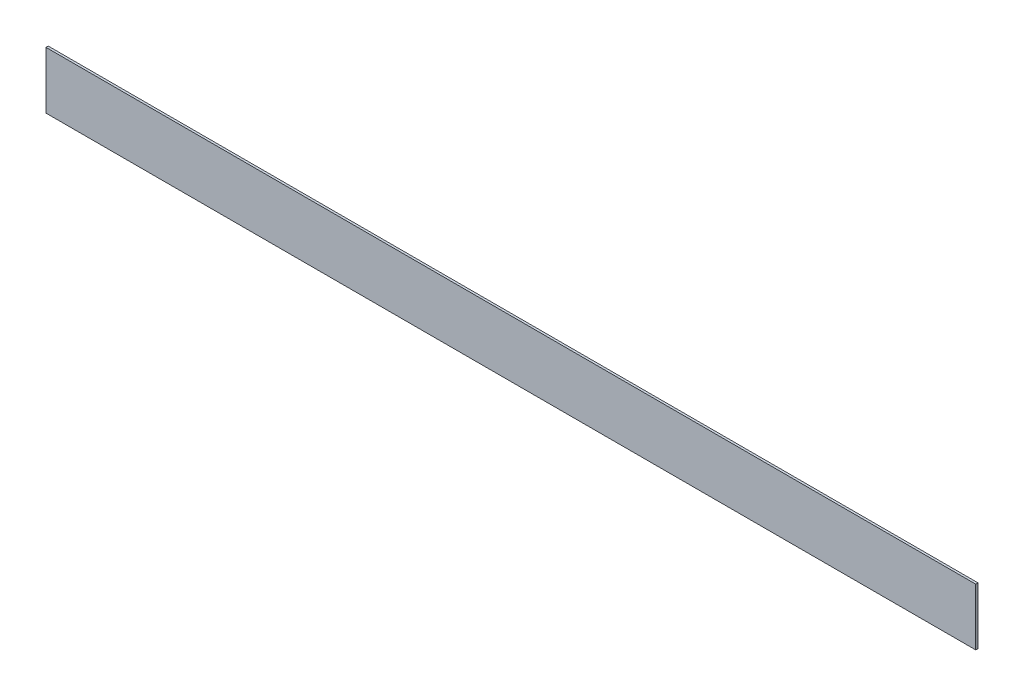
ISO-10303-21;
HEADER;
FILE_DESCRIPTION(('STEP AP214'),'2;1');
FILE_NAME('part.step','',(''),(''),'','','');
FILE_SCHEMA(('AUTOMOTIVE_DESIGN { 1 0 10303 214 1 1 1 1 }'));
ENDSEC;
DATA;
#1=APPLICATION_CONTEXT('core data for automotive mechanical design processes');
#2=APPLICATION_PROTOCOL_DEFINITION('international standard','automotive_design',2000,#1);
#3=PRODUCT_CONTEXT('',#1,'mechanical');
#4=PRODUCT('Part','Part','',(#3));
#5=PRODUCT_RELATED_PRODUCT_CATEGORY('part','',(#4));
#6=PRODUCT_DEFINITION_FORMATION('','',#4);
#7=PRODUCT_DEFINITION_CONTEXT('part definition',#1,'design');
#8=PRODUCT_DEFINITION('design','',#6,#7);
#9=PRODUCT_DEFINITION_SHAPE('','',#8);
#10=(LENGTH_UNIT() NAMED_UNIT(*) SI_UNIT(.MILLI.,.METRE.));
#11=(NAMED_UNIT(*) PLANE_ANGLE_UNIT() SI_UNIT($,.RADIAN.));
#12=(NAMED_UNIT(*) SI_UNIT($,.STERADIAN.) SOLID_ANGLE_UNIT());
#13=UNCERTAINTY_MEASURE_WITH_UNIT(LENGTH_MEASURE(1.E-05),#10,'distance_accuracy_value','');
#14=(GEOMETRIC_REPRESENTATION_CONTEXT(3) GLOBAL_UNCERTAINTY_ASSIGNED_CONTEXT((#13)) GLOBAL_UNIT_ASSIGNED_CONTEXT((#10,
#11,#12)) REPRESENTATION_CONTEXT('',''));
#15=CARTESIAN_POINT('',(0.,0.,0.));
#16=DIRECTION('',(0.,0.,1.));
#17=DIRECTION('',(1.,0.,0.));
#18=AXIS2_PLACEMENT_3D('',#15,#16,#17);
#19=CARTESIAN_POINT('',(0.,0.,5.));
#20=DIRECTION('',(1.,0.,0.));
#21=DIRECTION('',(0.,0.,-1.));
#22=AXIS2_PLACEMENT_3D('',#19,#20,#21);
#23=PLANE('',#22);
#24=DIRECTION('',(0.,-1.,0.));
#25=VECTOR('',#24,1.);
#26=CARTESIAN_POINT('',(0.,0.,0.));
#27=LINE('',#26,#25);
#28=CARTESIAN_POINT('',(0.,126.,0.));
#29=VERTEX_POINT('',#28);
#30=CARTESIAN_POINT('',(0.,0.,0.));
#31=VERTEX_POINT('',#30);
#32=EDGE_CURVE('E97',#29,#31,#27,.T.);
#33=ORIENTED_EDGE('',*,*,#32,.T.);
#34=DIRECTION('',(0.,0.,-1.));
#35=VECTOR('',#34,1.);
#36=CARTESIAN_POINT('',(0.,0.,5.));
#37=LINE('',#36,#35);
#38=CARTESIAN_POINT('',(0.,0.,5.));
#39=VERTEX_POINT('',#38);
#40=EDGE_CURVE('E11',#39,#31,#37,.T.);
#41=ORIENTED_EDGE('',*,*,#40,.F.);
#42=DIRECTION('',(0.,-1.,0.));
#43=VECTOR('',#42,1.);
#44=CARTESIAN_POINT('',(0.,0.,5.));
#45=LINE('',#44,#43);
#46=CARTESIAN_POINT('',(0.,126.,5.));
#47=VERTEX_POINT('',#46);
#48=EDGE_CURVE('E85',#47,#39,#45,.T.);
#49=ORIENTED_EDGE('',*,*,#48,.F.);
#50=DIRECTION('',(0.,0.,-1.));
#51=VECTOR('',#50,1.);
#52=CARTESIAN_POINT('',(0.,126.,5.));
#53=LINE('',#52,#51);
#54=EDGE_CURVE('E93',#47,#29,#53,.T.);
#55=ORIENTED_EDGE('',*,*,#54,.T.);
#56=EDGE_LOOP('',(#33,#41,#49,#55));
#57=FACE_BOUND('',#56,.T.);
#58=ADVANCED_FACE('F34',(#57),#23,.F.);
#59=CARTESIAN_POINT('',(0.,0.,5.));
#60=DIRECTION('',(0.,1.,0.));
#61=DIRECTION('',(0.,0.,1.));
#62=AXIS2_PLACEMENT_3D('',#59,#60,#61);
#63=PLANE('',#62);
#64=DIRECTION('',(1.,0.,0.));
#65=VECTOR('',#64,1.);
#66=CARTESIAN_POINT('',(0.,0.,0.));
#67=LINE('',#66,#65);
#68=CARTESIAN_POINT('',(2056.,0.,0.));
#69=VERTEX_POINT('',#68);
#70=EDGE_CURVE('E89',#31,#69,#67,.T.);
#71=ORIENTED_EDGE('',*,*,#70,.T.);
#72=DIRECTION('',(0.,0.,-1.));
#73=VECTOR('',#72,1.);
#74=CARTESIAN_POINT('',(2056.,0.,5.));
#75=LINE('',#74,#73);
#76=CARTESIAN_POINT('',(2056.,0.,5.));
#77=VERTEX_POINT('',#76);
#78=EDGE_CURVE('E42',#77,#69,#75,.T.);
#79=ORIENTED_EDGE('',*,*,#78,.F.);
#80=DIRECTION('',(1.,0.,0.));
#81=VECTOR('',#80,1.);
#82=CARTESIAN_POINT('',(0.,0.,5.));
#83=LINE('',#82,#81);
#84=EDGE_CURVE('E80',#39,#77,#83,.T.);
#85=ORIENTED_EDGE('',*,*,#84,.F.);
#86=ORIENTED_EDGE('',*,*,#40,.T.);
#87=EDGE_LOOP('',(#71,#79,#85,#86));
#88=FACE_BOUND('',#87,.T.);
#89=ADVANCED_FACE('F88',(#88),#63,.F.);
#90=CARTESIAN_POINT('',(2056.,0.,5.));
#91=DIRECTION('',(-1.,0.,0.));
#92=DIRECTION('',(0.,0.,1.));
#93=AXIS2_PLACEMENT_3D('',#90,#91,#92);
#94=PLANE('',#93);
#95=DIRECTION('',(0.,1.,0.));
#96=VECTOR('',#95,1.);
#97=CARTESIAN_POINT('',(2056.,0.,0.));
#98=LINE('',#97,#96);
#99=CARTESIAN_POINT('',(2056.,126.,0.));
#100=VERTEX_POINT('',#99);
#101=EDGE_CURVE('E67',#69,#100,#98,.T.);
#102=ORIENTED_EDGE('',*,*,#101,.T.);
#103=DIRECTION('',(0.,0.,-1.));
#104=VECTOR('',#103,1.);
#105=CARTESIAN_POINT('',(2056.,126.,5.));
#106=LINE('',#105,#104);
#107=CARTESIAN_POINT('',(2056.,126.,5.));
#108=VERTEX_POINT('',#107);
#109=EDGE_CURVE('E90',#108,#100,#106,.T.);
#110=ORIENTED_EDGE('',*,*,#109,.F.);
#111=DIRECTION('',(0.,1.,0.));
#112=VECTOR('',#111,1.);
#113=CARTESIAN_POINT('',(2056.,0.,5.));
#114=LINE('',#113,#112);
#115=EDGE_CURVE('E83',#77,#108,#114,.T.);
#116=ORIENTED_EDGE('',*,*,#115,.F.);
#117=ORIENTED_EDGE('',*,*,#78,.T.);
#118=EDGE_LOOP('',(#102,#110,#116,#117));
#119=FACE_BOUND('',#118,.T.);
#120=ADVANCED_FACE('F91',(#119),#94,.F.);
#121=CARTESIAN_POINT('',(0.,126.,5.));
#122=DIRECTION('',(0.,-1.,0.));
#123=DIRECTION('',(0.,0.,-1.));
#124=AXIS2_PLACEMENT_3D('',#121,#122,#123);
#125=PLANE('',#124);
#126=DIRECTION('',(-1.,0.,0.));
#127=VECTOR('',#126,1.);
#128=CARTESIAN_POINT('',(0.,126.,0.));
#129=LINE('',#128,#127);
#130=EDGE_CURVE('E73',#100,#29,#129,.T.);
#131=ORIENTED_EDGE('',*,*,#130,.T.);
#132=ORIENTED_EDGE('',*,*,#54,.F.);
#133=DIRECTION('',(-1.,0.,0.));
#134=VECTOR('',#133,1.);
#135=CARTESIAN_POINT('',(0.,126.,5.));
#136=LINE('',#135,#134);
#137=EDGE_CURVE('E50',#108,#47,#136,.T.);
#138=ORIENTED_EDGE('',*,*,#137,.F.);
#139=ORIENTED_EDGE('',*,*,#109,.T.);
#140=EDGE_LOOP('',(#131,#132,#138,#139));
#141=FACE_BOUND('',#140,.T.);
#142=ADVANCED_FACE('F104',(#141),#125,.F.);
#143=CARTESIAN_POINT('',(0.,0.,5.));
#144=DIRECTION('',(0.,0.,-1.));
#145=DIRECTION('',(-1.,0.,0.));
#146=AXIS2_PLACEMENT_3D('',#143,#144,#145);
#147=PLANE('',#146);
#148=ORIENTED_EDGE('',*,*,#48,.T.);
#149=ORIENTED_EDGE('',*,*,#84,.T.);
#150=ORIENTED_EDGE('',*,*,#115,.T.);
#151=ORIENTED_EDGE('',*,*,#137,.T.);
#152=EDGE_LOOP('',(#148,#149,#150,#151));
#153=FACE_BOUND('',#152,.T.);
#154=ADVANCED_FACE('F81',(#153),#147,.F.);
#155=CARTESIAN_POINT('',(0.,0.,0.));
#156=DIRECTION('',(0.,0.,-1.));
#157=DIRECTION('',(-1.,0.,0.));
#158=AXIS2_PLACEMENT_3D('',#155,#156,#157);
#159=PLANE('',#158);
#160=ORIENTED_EDGE('',*,*,#32,.F.);
#161=ORIENTED_EDGE('',*,*,#130,.F.);
#162=ORIENTED_EDGE('',*,*,#101,.F.);
#163=ORIENTED_EDGE('',*,*,#70,.F.);
#164=EDGE_LOOP('',(#160,#161,#162,#163));
#165=FACE_BOUND('',#164,.T.);
#166=ADVANCED_FACE('F107',(#165),#159,.T.);
#167=CLOSED_SHELL('',(#58,#89,#120,#142,#154,#166));
#168=MANIFOLD_SOLID_BREP('B2',#167);
#169=ADVANCED_BREP_SHAPE_REPRESENTATION('',(#18,#168),#14);
#170=SHAPE_DEFINITION_REPRESENTATION(#9,#169);
ENDSEC;
END-ISO-10303-21;
